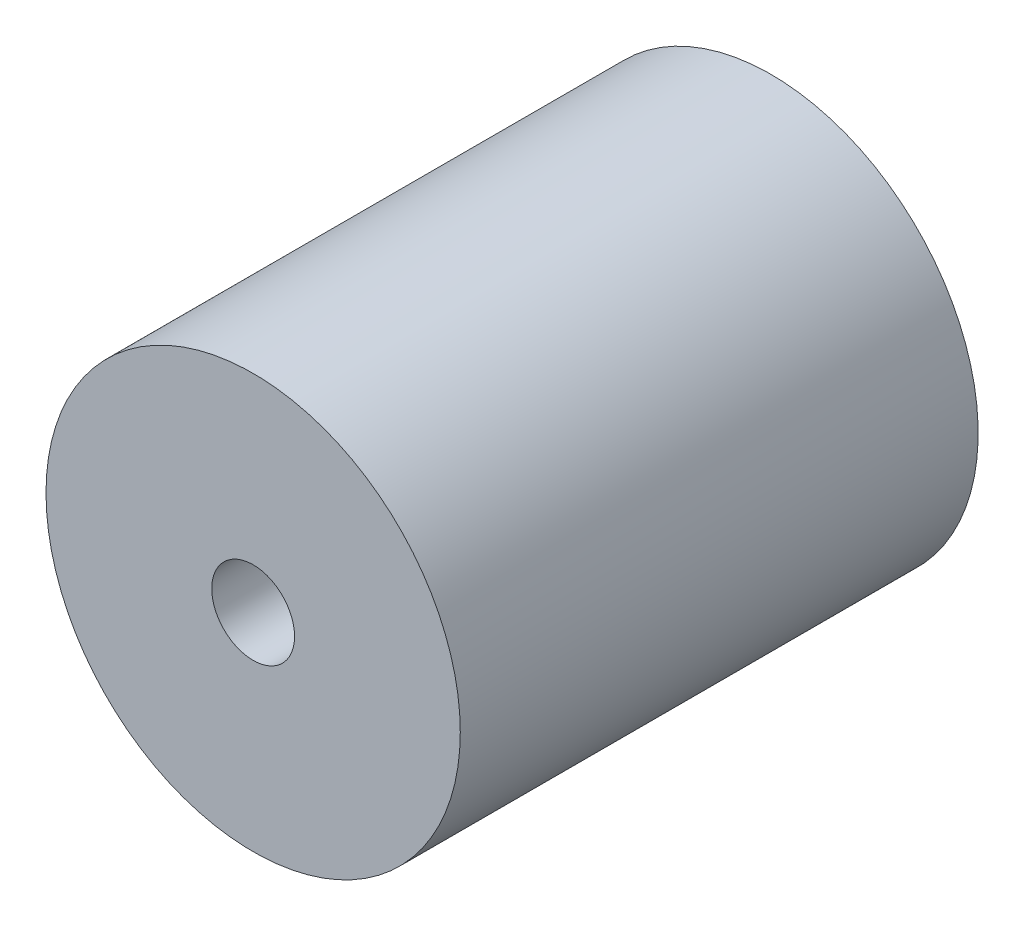
ISO-10303-21;
HEADER;
FILE_DESCRIPTION(('STEP AP214'),'2;1');
FILE_NAME('part.step','',(''),(''),'','','');
FILE_SCHEMA(('AUTOMOTIVE_DESIGN { 1 0 10303 214 1 1 1 1 }'));
ENDSEC;
DATA;
#1=APPLICATION_CONTEXT('core data for automotive mechanical design processes');
#2=APPLICATION_PROTOCOL_DEFINITION('international standard','automotive_design',2000,#1);
#3=PRODUCT_CONTEXT('',#1,'mechanical');
#4=PRODUCT('Part','Part','',(#3));
#5=PRODUCT_RELATED_PRODUCT_CATEGORY('part','',(#4));
#6=PRODUCT_DEFINITION_FORMATION('','',#4);
#7=PRODUCT_DEFINITION_CONTEXT('part definition',#1,'design');
#8=PRODUCT_DEFINITION('design','',#6,#7);
#9=PRODUCT_DEFINITION_SHAPE('','',#8);
#10=(LENGTH_UNIT() NAMED_UNIT(*) SI_UNIT(.MILLI.,.METRE.));
#11=(NAMED_UNIT(*) PLANE_ANGLE_UNIT() SI_UNIT($,.RADIAN.));
#12=(NAMED_UNIT(*) SI_UNIT($,.STERADIAN.) SOLID_ANGLE_UNIT());
#13=UNCERTAINTY_MEASURE_WITH_UNIT(LENGTH_MEASURE(1.E-05),#10,'distance_accuracy_value','');
#14=(GEOMETRIC_REPRESENTATION_CONTEXT(3) GLOBAL_UNCERTAINTY_ASSIGNED_CONTEXT((#13)) GLOBAL_UNIT_ASSIGNED_CONTEXT((#10,
#11,#12)) REPRESENTATION_CONTEXT('',''));
#15=CARTESIAN_POINT('',(0.,0.,0.));
#16=DIRECTION('',(0.,0.,1.));
#17=DIRECTION('',(1.,0.,0.));
#18=AXIS2_PLACEMENT_3D('',#15,#16,#17);
#19=CARTESIAN_POINT('',(0.,0.,10.));
#20=DIRECTION('',(0.,0.,1.));
#21=DIRECTION('',(1.,0.,0.));
#22=AXIS2_PLACEMENT_3D('',#19,#20,#21);
#23=PLANE('',#22);
#24=CARTESIAN_POINT('',(0.,0.,10.));
#25=DIRECTION('',(0.,0.,1.));
#26=DIRECTION('',(1.,0.,0.));
#27=AXIS2_PLACEMENT_3D('',#24,#25,#26);
#28=CIRCLE('',#27,10.);
#29=CARTESIAN_POINT('',(10.,0.,10.));
#30=VERTEX_POINT('',#29);
#31=EDGE_CURVE('E52',#30,#30,#28,.T.);
#32=ORIENTED_EDGE('',*,*,#31,.T.);
#33=EDGE_LOOP('',(#32));
#34=FACE_BOUND('',#33,.T.);
#35=CARTESIAN_POINT('',(0.,0.,10.));
#36=DIRECTION('',(0.,0.,1.));
#37=DIRECTION('',(1.,0.,0.));
#38=AXIS2_PLACEMENT_3D('',#35,#36,#37);
#39=CIRCLE('',#38,2.);
#40=CARTESIAN_POINT('',(2.,0.,10.));
#41=VERTEX_POINT('',#40);
#42=EDGE_CURVE('E56',#41,#41,#39,.T.);
#43=ORIENTED_EDGE('',*,*,#42,.F.);
#44=EDGE_LOOP('',(#43));
#45=FACE_BOUND('',#44,.T.);
#46=ADVANCED_FACE('F45',(#34,#45),#23,.T.);
#47=CARTESIAN_POINT('',(0.,0.,10.));
#48=DIRECTION('',(0.,0.,-1.));
#49=DIRECTION('',(-1.,0.,0.));
#50=AXIS2_PLACEMENT_3D('',#47,#48,#49);
#51=CYLINDRICAL_SURFACE('',#50,10.);
#52=ORIENTED_EDGE('',*,*,#31,.F.);
#53=EDGE_LOOP('',(#52));
#54=FACE_BOUND('',#53,.T.);
#55=CARTESIAN_POINT('',(0.,0.,-15.));
#56=DIRECTION('',(0.,0.,-1.));
#57=DIRECTION('',(-1.,0.,0.));
#58=AXIS2_PLACEMENT_3D('',#55,#56,#57);
#59=CIRCLE('',#58,10.);
#60=CARTESIAN_POINT('',(-10.,0.,-15.));
#61=VERTEX_POINT('',#60);
#62=EDGE_CURVE('E64',#61,#61,#59,.T.);
#63=ORIENTED_EDGE('',*,*,#62,.F.);
#64=EDGE_LOOP('',(#63));
#65=FACE_BOUND('',#64,.T.);
#66=ADVANCED_FACE('F47',(#54,#65),#51,.T.);
#67=CARTESIAN_POINT('',(0.,0.,10.));
#68=DIRECTION('',(0.,0.,-1.));
#69=DIRECTION('',(-1.,0.,0.));
#70=AXIS2_PLACEMENT_3D('',#67,#68,#69);
#71=CYLINDRICAL_SURFACE('',#70,2.);
#72=ORIENTED_EDGE('',*,*,#42,.T.);
#73=EDGE_LOOP('',(#72));
#74=FACE_BOUND('',#73,.T.);
#75=CARTESIAN_POINT('',(0.,0.,0.));
#76=DIRECTION('',(0.,0.,1.));
#77=DIRECTION('',(1.,0.,0.));
#78=AXIS2_PLACEMENT_3D('',#75,#76,#77);
#79=CIRCLE('',#78,2.);
#80=CARTESIAN_POINT('',(2.,0.,0.));
#81=VERTEX_POINT('',#80);
#82=EDGE_CURVE('E60',#81,#81,#79,.T.);
#83=ORIENTED_EDGE('',*,*,#82,.F.);
#84=EDGE_LOOP('',(#83));
#85=FACE_BOUND('',#84,.T.);
#86=ADVANCED_FACE('F86',(#74,#85),#71,.F.);
#87=CARTESIAN_POINT('',(0.,0.,0.));
#88=DIRECTION('',(0.,0.,-1.));
#89=DIRECTION('',(-1.,0.,0.));
#90=AXIS2_PLACEMENT_3D('',#87,#88,#89);
#91=PLANE('',#90);
#92=ORIENTED_EDGE('',*,*,#82,.T.);
#93=EDGE_LOOP('',(#92));
#94=FACE_BOUND('',#93,.T.);
#95=ADVANCED_FACE('F76',(#94),#91,.F.);
#96=CARTESIAN_POINT('',(0.,0.,-15.));
#97=DIRECTION('',(0.,0.,-1.));
#98=DIRECTION('',(-1.,0.,0.));
#99=AXIS2_PLACEMENT_3D('',#96,#97,#98);
#100=PLANE('',#99);
#101=ORIENTED_EDGE('',*,*,#62,.T.);
#102=EDGE_LOOP('',(#101));
#103=FACE_BOUND('',#102,.T.);
#104=CARTESIAN_POINT('',(0.,0.,-15.));
#105=DIRECTION('',(0.,0.,-1.));
#106=DIRECTION('',(-1.,0.,0.));
#107=AXIS2_PLACEMENT_3D('',#104,#105,#106);
#108=CIRCLE('',#107,2.);
#109=CARTESIAN_POINT('',(-2.,0.,-15.));
#110=VERTEX_POINT('',#109);
#111=EDGE_CURVE('E68',#110,#110,#108,.T.);
#112=ORIENTED_EDGE('',*,*,#111,.F.);
#113=EDGE_LOOP('',(#112));
#114=FACE_BOUND('',#113,.T.);
#115=ADVANCED_FACE('F74',(#103,#114),#100,.T.);
#116=CARTESIAN_POINT('',(0.,0.,-15.));
#117=DIRECTION('',(0.,0.,1.));
#118=DIRECTION('',(1.,0.,0.));
#119=AXIS2_PLACEMENT_3D('',#116,#117,#118);
#120=CYLINDRICAL_SURFACE('',#119,2.);
#121=ORIENTED_EDGE('',*,*,#111,.T.);
#122=EDGE_LOOP('',(#121));
#123=FACE_BOUND('',#122,.T.);
#124=CARTESIAN_POINT('',(0.,0.,-5.));
#125=DIRECTION('',(0.,0.,-1.));
#126=DIRECTION('',(-1.,0.,0.));
#127=AXIS2_PLACEMENT_3D('',#124,#125,#126);
#128=CIRCLE('',#127,2.);
#129=CARTESIAN_POINT('',(-2.,0.,-5.));
#130=VERTEX_POINT('',#129);
#131=EDGE_CURVE('E10',#130,#130,#128,.F.);
#132=ORIENTED_EDGE('',*,*,#131,.T.);
#133=EDGE_LOOP('',(#132));
#134=FACE_BOUND('',#133,.T.);
#135=ADVANCED_FACE('F72',(#123,#134),#120,.F.);
#136=CARTESIAN_POINT('',(0.,0.,-5.));
#137=DIRECTION('',(0.,0.,-1.));
#138=DIRECTION('',(-1.,0.,0.));
#139=AXIS2_PLACEMENT_3D('',#136,#137,#138);
#140=PLANE('',#139);
#141=ORIENTED_EDGE('',*,*,#131,.F.);
#142=EDGE_LOOP('',(#141));
#143=FACE_BOUND('',#142,.T.);
#144=ADVANCED_FACE('F83',(#143),#140,.T.);
#145=CLOSED_SHELL('',(#46,#66,#86,#95,#115,#135,#144));
#146=MANIFOLD_SOLID_BREP('B2',#145);
#147=ADVANCED_BREP_SHAPE_REPRESENTATION('',(#18,#146),#14);
#148=SHAPE_DEFINITION_REPRESENTATION(#9,#147);
ENDSEC;
END-ISO-10303-21;
